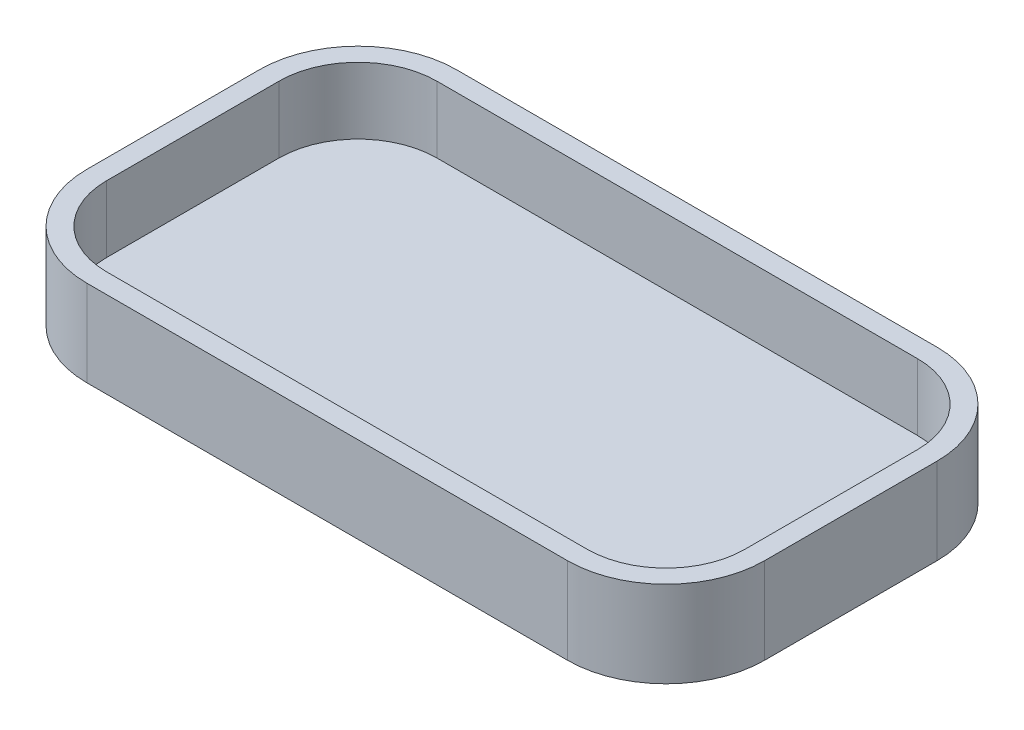
ISO-10303-21;
HEADER;
FILE_DESCRIPTION(('STEP AP214'),'2;1');
FILE_NAME('part.step','',(''),(''),'','','');
FILE_SCHEMA(('AUTOMOTIVE_DESIGN { 1 0 10303 214 1 1 1 1 }'));
ENDSEC;
DATA;
#1=APPLICATION_CONTEXT('core data for automotive mechanical design processes');
#2=APPLICATION_PROTOCOL_DEFINITION('international standard','automotive_design',2000,#1);
#3=PRODUCT_CONTEXT('',#1,'mechanical');
#4=PRODUCT('Part','Part','',(#3));
#5=PRODUCT_RELATED_PRODUCT_CATEGORY('part','',(#4));
#6=PRODUCT_DEFINITION_FORMATION('','',#4);
#7=PRODUCT_DEFINITION_CONTEXT('part definition',#1,'design');
#8=PRODUCT_DEFINITION('design','',#6,#7);
#9=PRODUCT_DEFINITION_SHAPE('','',#8);
#10=(LENGTH_UNIT() NAMED_UNIT(*) SI_UNIT(.MILLI.,.METRE.));
#11=(NAMED_UNIT(*) PLANE_ANGLE_UNIT() SI_UNIT($,.RADIAN.));
#12=(NAMED_UNIT(*) SI_UNIT($,.STERADIAN.) SOLID_ANGLE_UNIT());
#13=UNCERTAINTY_MEASURE_WITH_UNIT(LENGTH_MEASURE(1.E-05),#10,'distance_accuracy_value','');
#14=(GEOMETRIC_REPRESENTATION_CONTEXT(3) GLOBAL_UNCERTAINTY_ASSIGNED_CONTEXT((#13)) GLOBAL_UNIT_ASSIGNED_CONTEXT((#10,
#11,#12)) REPRESENTATION_CONTEXT('',''));
#15=CARTESIAN_POINT('',(0.,0.,0.));
#16=DIRECTION('',(0.,0.,1.));
#17=DIRECTION('',(1.,0.,0.));
#18=AXIS2_PLACEMENT_3D('',#15,#16,#17);
#19=CARTESIAN_POINT('',(27.5,7.,15.));
#20=DIRECTION('',(-1.,0.,0.));
#21=DIRECTION('',(0.,0.,1.));
#22=AXIS2_PLACEMENT_3D('',#19,#20,#21);
#23=PLANE('',#22);
#24=DIRECTION('',(0.,0.,-1.));
#25=VECTOR('',#24,1.);
#26=CARTESIAN_POINT('',(27.5,0.,15.));
#27=LINE('',#26,#25);
#28=CARTESIAN_POINT('',(27.5,0.,7.));
#29=VERTEX_POINT('',#28);
#30=CARTESIAN_POINT('',(27.5,0.,-7.));
#31=VERTEX_POINT('',#30);
#32=EDGE_CURVE('E206',#29,#31,#27,.T.);
#33=ORIENTED_EDGE('',*,*,#32,.T.);
#34=DIRECTION('',(0.,-1.,0.));
#35=VECTOR('',#34,1.);
#36=CARTESIAN_POINT('',(27.5,7.,-7.));
#37=LINE('',#36,#35);
#38=CARTESIAN_POINT('',(27.5,7.,-7.));
#39=VERTEX_POINT('',#38);
#40=EDGE_CURVE('E271',#31,#39,#37,.F.);
#41=ORIENTED_EDGE('',*,*,#40,.T.);
#42=DIRECTION('',(0.,0.,-1.));
#43=VECTOR('',#42,1.);
#44=CARTESIAN_POINT('',(27.5,7.,15.));
#45=LINE('',#44,#43);
#46=CARTESIAN_POINT('',(27.5,7.,7.));
#47=VERTEX_POINT('',#46);
#48=EDGE_CURVE('E222',#47,#39,#45,.T.);
#49=ORIENTED_EDGE('',*,*,#48,.F.);
#50=DIRECTION('',(0.,-1.,0.));
#51=VECTOR('',#50,1.);
#52=CARTESIAN_POINT('',(27.5,7.,7.));
#53=LINE('',#52,#51);
#54=EDGE_CURVE('E268',#47,#29,#53,.T.);
#55=ORIENTED_EDGE('',*,*,#54,.T.);
#56=EDGE_LOOP('',(#33,#41,#49,#55));
#57=FACE_BOUND('',#56,.T.);
#58=ADVANCED_FACE('F44',(#57),#23,.F.);
#59=CARTESIAN_POINT('',(-27.5,7.,-15.));
#60=DIRECTION('',(0.,0.,1.));
#61=DIRECTION('',(1.,0.,0.));
#62=AXIS2_PLACEMENT_3D('',#59,#60,#61);
#63=PLANE('',#62);
#64=DIRECTION('',(-1.,0.,0.));
#65=VECTOR('',#64,1.);
#66=CARTESIAN_POINT('',(-27.5,0.,-15.));
#67=LINE('',#66,#65);
#68=CARTESIAN_POINT('',(19.5,0.,-15.));
#69=VERTEX_POINT('',#68);
#70=CARTESIAN_POINT('',(-19.5,0.,-15.));
#71=VERTEX_POINT('',#70);
#72=EDGE_CURVE('E237',#69,#71,#67,.T.);
#73=ORIENTED_EDGE('',*,*,#72,.T.);
#74=DIRECTION('',(0.,-1.,0.));
#75=VECTOR('',#74,1.);
#76=CARTESIAN_POINT('',(-19.5,7.,-15.));
#77=LINE('',#76,#75);
#78=CARTESIAN_POINT('',(-19.5,7.,-15.));
#79=VERTEX_POINT('',#78);
#80=EDGE_CURVE('E256',#71,#79,#77,.F.);
#81=ORIENTED_EDGE('',*,*,#80,.T.);
#82=DIRECTION('',(-1.,0.,0.));
#83=VECTOR('',#82,1.);
#84=CARTESIAN_POINT('',(-27.5,7.,-15.));
#85=LINE('',#84,#83);
#86=CARTESIAN_POINT('',(19.5,7.,-15.));
#87=VERTEX_POINT('',#86);
#88=EDGE_CURVE('E221',#87,#79,#85,.T.);
#89=ORIENTED_EDGE('',*,*,#88,.F.);
#90=DIRECTION('',(0.,-1.,0.));
#91=VECTOR('',#90,1.);
#92=CARTESIAN_POINT('',(19.5,7.,-15.));
#93=LINE('',#92,#91);
#94=EDGE_CURVE('E254',#87,#69,#93,.T.);
#95=ORIENTED_EDGE('',*,*,#94,.T.);
#96=EDGE_LOOP('',(#73,#81,#89,#95));
#97=FACE_BOUND('',#96,.T.);
#98=ADVANCED_FACE('F300',(#97),#63,.F.);
#99=CARTESIAN_POINT('',(-27.5,7.,15.));
#100=DIRECTION('',(1.,0.,0.));
#101=DIRECTION('',(0.,0.,-1.));
#102=AXIS2_PLACEMENT_3D('',#99,#100,#101);
#103=PLANE('',#102);
#104=DIRECTION('',(0.,0.,1.));
#105=VECTOR('',#104,1.);
#106=CARTESIAN_POINT('',(-27.5,7.,15.));
#107=LINE('',#106,#105);
#108=CARTESIAN_POINT('',(-27.5,7.,-7.));
#109=VERTEX_POINT('',#108);
#110=CARTESIAN_POINT('',(-27.5,7.,7.));
#111=VERTEX_POINT('',#110);
#112=EDGE_CURVE('E230',#109,#111,#107,.T.);
#113=ORIENTED_EDGE('',*,*,#112,.F.);
#114=DIRECTION('',(0.,-1.,0.));
#115=VECTOR('',#114,1.);
#116=CARTESIAN_POINT('',(-27.5,7.,-7.));
#117=LINE('',#116,#115);
#118=CARTESIAN_POINT('',(-27.5,0.,-7.));
#119=VERTEX_POINT('',#118);
#120=EDGE_CURVE('E243',#109,#119,#117,.T.);
#121=ORIENTED_EDGE('',*,*,#120,.T.);
#122=DIRECTION('',(0.,0.,1.));
#123=VECTOR('',#122,1.);
#124=CARTESIAN_POINT('',(-27.5,0.,15.));
#125=LINE('',#124,#123);
#126=CARTESIAN_POINT('',(-27.5,0.,7.));
#127=VERTEX_POINT('',#126);
#128=EDGE_CURVE('E239',#119,#127,#125,.T.);
#129=ORIENTED_EDGE('',*,*,#128,.T.);
#130=DIRECTION('',(0.,-1.,0.));
#131=VECTOR('',#130,1.);
#132=CARTESIAN_POINT('',(-27.5,7.,7.));
#133=LINE('',#132,#131);
#134=EDGE_CURVE('E233',#127,#111,#133,.F.);
#135=ORIENTED_EDGE('',*,*,#134,.T.);
#136=EDGE_LOOP('',(#113,#121,#129,#135));
#137=FACE_BOUND('',#136,.T.);
#138=ADVANCED_FACE('F308',(#137),#103,.F.);
#139=CARTESIAN_POINT('',(-27.5,7.,15.));
#140=DIRECTION('',(0.,0.,-1.));
#141=DIRECTION('',(-1.,0.,0.));
#142=AXIS2_PLACEMENT_3D('',#139,#140,#141);
#143=PLANE('',#142);
#144=DIRECTION('',(1.,0.,0.));
#145=VECTOR('',#144,1.);
#146=CARTESIAN_POINT('',(-27.5,0.,15.));
#147=LINE('',#146,#145);
#148=CARTESIAN_POINT('',(-19.5,0.,15.));
#149=VERTEX_POINT('',#148);
#150=CARTESIAN_POINT('',(19.5,0.,15.));
#151=VERTEX_POINT('',#150);
#152=EDGE_CURVE('E223',#149,#151,#147,.T.);
#153=ORIENTED_EDGE('',*,*,#152,.T.);
#154=DIRECTION('',(0.,-1.,0.));
#155=VECTOR('',#154,1.);
#156=CARTESIAN_POINT('',(19.5,7.,15.));
#157=LINE('',#156,#155);
#158=CARTESIAN_POINT('',(19.5,7.,15.));
#159=VERTEX_POINT('',#158);
#160=EDGE_CURVE('E11',#151,#159,#157,.F.);
#161=ORIENTED_EDGE('',*,*,#160,.T.);
#162=DIRECTION('',(1.,0.,0.));
#163=VECTOR('',#162,1.);
#164=CARTESIAN_POINT('',(-27.5,7.,15.));
#165=LINE('',#164,#163);
#166=CARTESIAN_POINT('',(-19.5,7.,15.));
#167=VERTEX_POINT('',#166);
#168=EDGE_CURVE('E231',#167,#159,#165,.T.);
#169=ORIENTED_EDGE('',*,*,#168,.F.);
#170=DIRECTION('',(0.,-1.,0.));
#171=VECTOR('',#170,1.);
#172=CARTESIAN_POINT('',(-19.5,7.,15.));
#173=LINE('',#172,#171);
#174=EDGE_CURVE('E52',#167,#149,#173,.T.);
#175=ORIENTED_EDGE('',*,*,#174,.T.);
#176=EDGE_LOOP('',(#153,#161,#169,#175));
#177=FACE_BOUND('',#176,.T.);
#178=ADVANCED_FACE('F274',(#177),#143,.F.);
#179=CARTESIAN_POINT('',(0.,7.,0.));
#180=DIRECTION('',(0.,-1.,0.));
#181=DIRECTION('',(0.,0.,-1.));
#182=AXIS2_PLACEMENT_3D('',#179,#180,#181);
#183=PLANE('',#182);
#184=DIRECTION('',(-1.,0.,0.));
#185=VECTOR('',#184,1.);
#186=CARTESIAN_POINT('',(0.,7.,-13.4));
#187=LINE('',#186,#185);
#188=CARTESIAN_POINT('',(19.5,7.,-13.4));
#189=VERTEX_POINT('',#188);
#190=CARTESIAN_POINT('',(-19.5,7.,-13.4));
#191=VERTEX_POINT('',#190);
#192=EDGE_CURVE('E183',#189,#191,#187,.T.);
#193=ORIENTED_EDGE('',*,*,#192,.F.);
#194=CARTESIAN_POINT('',(19.5,7.,-7.));
#195=DIRECTION('',(0.,-1.,0.));
#196=DIRECTION('',(0.,0.,-1.));
#197=AXIS2_PLACEMENT_3D('',#194,#195,#196);
#198=CIRCLE('',#197,6.4);
#199=CARTESIAN_POINT('',(25.9,7.,-7.));
#200=VERTEX_POINT('',#199);
#201=EDGE_CURVE('E207',#200,#189,#198,.F.);
#202=ORIENTED_EDGE('',*,*,#201,.F.);
#203=DIRECTION('',(0.,0.,-1.));
#204=VECTOR('',#203,1.);
#205=CARTESIAN_POINT('',(25.9,7.,0.));
#206=LINE('',#205,#204);
#207=CARTESIAN_POINT('',(25.9,7.,7.));
#208=VERTEX_POINT('',#207);
#209=EDGE_CURVE('E58',#208,#200,#206,.T.);
#210=ORIENTED_EDGE('',*,*,#209,.F.);
#211=CARTESIAN_POINT('',(19.5,7.,7.));
#212=DIRECTION('',(0.,-1.,0.));
#213=DIRECTION('',(0.,0.,-1.));
#214=AXIS2_PLACEMENT_3D('',#211,#212,#213);
#215=CIRCLE('',#214,6.4);
#216=CARTESIAN_POINT('',(19.5,7.,13.4));
#217=VERTEX_POINT('',#216);
#218=EDGE_CURVE('E188',#217,#208,#215,.F.);
#219=ORIENTED_EDGE('',*,*,#218,.F.);
#220=DIRECTION('',(1.,0.,0.));
#221=VECTOR('',#220,1.);
#222=CARTESIAN_POINT('',(0.,7.,13.4));
#223=LINE('',#222,#221);
#224=CARTESIAN_POINT('',(-19.5,7.,13.4));
#225=VERTEX_POINT('',#224);
#226=EDGE_CURVE('E200',#225,#217,#223,.T.);
#227=ORIENTED_EDGE('',*,*,#226,.F.);
#228=CARTESIAN_POINT('',(-19.5,7.,7.));
#229=DIRECTION('',(0.,-1.,0.));
#230=DIRECTION('',(0.,0.,-1.));
#231=AXIS2_PLACEMENT_3D('',#228,#229,#230);
#232=CIRCLE('',#231,6.4);
#233=CARTESIAN_POINT('',(-25.9,7.,7.));
#234=VERTEX_POINT('',#233);
#235=EDGE_CURVE('E186',#234,#225,#232,.F.);
#236=ORIENTED_EDGE('',*,*,#235,.F.);
#237=DIRECTION('',(0.,0.,1.));
#238=VECTOR('',#237,1.);
#239=CARTESIAN_POINT('',(-25.9,7.,0.));
#240=LINE('',#239,#238);
#241=CARTESIAN_POINT('',(-25.9,7.,-7.));
#242=VERTEX_POINT('',#241);
#243=EDGE_CURVE('E213',#242,#234,#240,.T.);
#244=ORIENTED_EDGE('',*,*,#243,.F.);
#245=CARTESIAN_POINT('',(-19.5,7.,-7.));
#246=DIRECTION('',(0.,-1.,0.));
#247=DIRECTION('',(0.,0.,-1.));
#248=AXIS2_PLACEMENT_3D('',#245,#246,#247);
#249=CIRCLE('',#248,6.4);
#250=EDGE_CURVE('E211',#191,#242,#249,.F.);
#251=ORIENTED_EDGE('',*,*,#250,.F.);
#252=EDGE_LOOP('',(#193,#202,#210,#219,#227,#236,#244,#251));
#253=FACE_BOUND('',#252,.T.);
#254=ORIENTED_EDGE('',*,*,#88,.T.);
#255=CARTESIAN_POINT('',(-19.5,7.,-7.));
#256=DIRECTION('',(0.,-1.,0.));
#257=DIRECTION('',(0.,0.,-1.));
#258=AXIS2_PLACEMENT_3D('',#255,#256,#257);
#259=CIRCLE('',#258,8.);
#260=EDGE_CURVE('E266',#79,#109,#259,.F.);
#261=ORIENTED_EDGE('',*,*,#260,.T.);
#262=ORIENTED_EDGE('',*,*,#112,.T.);
#263=CARTESIAN_POINT('',(-19.5,7.,7.));
#264=DIRECTION('',(0.,-1.,0.));
#265=DIRECTION('',(0.,0.,-1.));
#266=AXIS2_PLACEMENT_3D('',#263,#264,#265);
#267=CIRCLE('',#266,8.);
#268=EDGE_CURVE('E257',#111,#167,#267,.F.);
#269=ORIENTED_EDGE('',*,*,#268,.T.);
#270=ORIENTED_EDGE('',*,*,#168,.T.);
#271=CARTESIAN_POINT('',(19.5,7.,7.));
#272=DIRECTION('',(0.,-1.,0.));
#273=DIRECTION('',(0.,0.,-1.));
#274=AXIS2_PLACEMENT_3D('',#271,#272,#273);
#275=CIRCLE('',#274,8.);
#276=EDGE_CURVE('E265',#159,#47,#275,.F.);
#277=ORIENTED_EDGE('',*,*,#276,.T.);
#278=ORIENTED_EDGE('',*,*,#48,.T.);
#279=CARTESIAN_POINT('',(19.5,7.,-7.));
#280=DIRECTION('',(0.,-1.,0.));
#281=DIRECTION('',(0.,0.,-1.));
#282=AXIS2_PLACEMENT_3D('',#279,#280,#281);
#283=CIRCLE('',#282,8.);
#284=EDGE_CURVE('E262',#39,#87,#283,.F.);
#285=ORIENTED_EDGE('',*,*,#284,.T.);
#286=EDGE_LOOP('',(#254,#261,#262,#269,#270,#277,#278,#285));
#287=FACE_BOUND('',#286,.T.);
#288=ADVANCED_FACE('F292',(#253,#287),#183,.F.);
#289=CARTESIAN_POINT('',(0.,0.,0.));
#290=DIRECTION('',(0.,-1.,0.));
#291=DIRECTION('',(0.,0.,-1.));
#292=AXIS2_PLACEMENT_3D('',#289,#290,#291);
#293=PLANE('',#292);
#294=ORIENTED_EDGE('',*,*,#128,.F.);
#295=CARTESIAN_POINT('',(-19.5,0.,-7.));
#296=DIRECTION('',(0.,-1.,0.));
#297=DIRECTION('',(0.,0.,-1.));
#298=AXIS2_PLACEMENT_3D('',#295,#296,#297);
#299=CIRCLE('',#298,8.);
#300=EDGE_CURVE('E251',#119,#71,#299,.T.);
#301=ORIENTED_EDGE('',*,*,#300,.T.);
#302=ORIENTED_EDGE('',*,*,#72,.F.);
#303=CARTESIAN_POINT('',(19.5,0.,-7.));
#304=DIRECTION('',(0.,-1.,0.));
#305=DIRECTION('',(0.,0.,-1.));
#306=AXIS2_PLACEMENT_3D('',#303,#304,#305);
#307=CIRCLE('',#306,8.);
#308=EDGE_CURVE('E253',#69,#31,#307,.T.);
#309=ORIENTED_EDGE('',*,*,#308,.T.);
#310=ORIENTED_EDGE('',*,*,#32,.F.);
#311=CARTESIAN_POINT('',(19.5,0.,7.));
#312=DIRECTION('',(0.,-1.,0.));
#313=DIRECTION('',(0.,0.,-1.));
#314=AXIS2_PLACEMENT_3D('',#311,#312,#313);
#315=CIRCLE('',#314,8.);
#316=EDGE_CURVE('E247',#29,#151,#315,.T.);
#317=ORIENTED_EDGE('',*,*,#316,.T.);
#318=ORIENTED_EDGE('',*,*,#152,.F.);
#319=CARTESIAN_POINT('',(-19.5,0.,7.));
#320=DIRECTION('',(0.,-1.,0.));
#321=DIRECTION('',(0.,0.,-1.));
#322=AXIS2_PLACEMENT_3D('',#319,#320,#321);
#323=CIRCLE('',#322,8.);
#324=EDGE_CURVE('E250',#149,#127,#323,.T.);
#325=ORIENTED_EDGE('',*,*,#324,.T.);
#326=EDGE_LOOP('',(#294,#301,#302,#309,#310,#317,#318,#325));
#327=FACE_BOUND('',#326,.T.);
#328=ADVANCED_FACE('F278',(#327),#293,.T.);
#329=CARTESIAN_POINT('',(-19.5,7.,-7.));
#330=DIRECTION('',(0.,-1.,0.));
#331=DIRECTION('',(0.,0.,-1.));
#332=AXIS2_PLACEMENT_3D('',#329,#330,#331);
#333=CYLINDRICAL_SURFACE('',#332,8.);
#334=ORIENTED_EDGE('',*,*,#260,.F.);
#335=ORIENTED_EDGE('',*,*,#80,.F.);
#336=ORIENTED_EDGE('',*,*,#300,.F.);
#337=ORIENTED_EDGE('',*,*,#120,.F.);
#338=EDGE_LOOP('',(#334,#335,#336,#337));
#339=FACE_BOUND('',#338,.T.);
#340=ADVANCED_FACE('F303',(#339),#333,.T.);
#341=CARTESIAN_POINT('',(19.5,7.,-7.));
#342=DIRECTION('',(0.,-1.,0.));
#343=DIRECTION('',(0.,0.,-1.));
#344=AXIS2_PLACEMENT_3D('',#341,#342,#343);
#345=CYLINDRICAL_SURFACE('',#344,8.);
#346=ORIENTED_EDGE('',*,*,#284,.F.);
#347=ORIENTED_EDGE('',*,*,#40,.F.);
#348=ORIENTED_EDGE('',*,*,#308,.F.);
#349=ORIENTED_EDGE('',*,*,#94,.F.);
#350=EDGE_LOOP('',(#346,#347,#348,#349));
#351=FACE_BOUND('',#350,.T.);
#352=ADVANCED_FACE('F293',(#351),#345,.T.);
#353=CARTESIAN_POINT('',(19.5,7.,7.));
#354=DIRECTION('',(0.,-1.,0.));
#355=DIRECTION('',(0.,0.,-1.));
#356=AXIS2_PLACEMENT_3D('',#353,#354,#355);
#357=CYLINDRICAL_SURFACE('',#356,8.);
#358=ORIENTED_EDGE('',*,*,#276,.F.);
#359=ORIENTED_EDGE('',*,*,#160,.F.);
#360=ORIENTED_EDGE('',*,*,#316,.F.);
#361=ORIENTED_EDGE('',*,*,#54,.F.);
#362=EDGE_LOOP('',(#358,#359,#360,#361));
#363=FACE_BOUND('',#362,.T.);
#364=ADVANCED_FACE('F282',(#363),#357,.T.);
#365=CARTESIAN_POINT('',(-19.5,7.,7.));
#366=DIRECTION('',(0.,-1.,0.));
#367=DIRECTION('',(0.,0.,-1.));
#368=AXIS2_PLACEMENT_3D('',#365,#366,#367);
#369=CYLINDRICAL_SURFACE('',#368,8.);
#370=ORIENTED_EDGE('',*,*,#268,.F.);
#371=ORIENTED_EDGE('',*,*,#134,.F.);
#372=ORIENTED_EDGE('',*,*,#324,.F.);
#373=ORIENTED_EDGE('',*,*,#174,.F.);
#374=EDGE_LOOP('',(#370,#371,#372,#373));
#375=FACE_BOUND('',#374,.T.);
#376=ADVANCED_FACE('F50',(#375),#369,.T.);
#377=CARTESIAN_POINT('',(25.9,7.,15.));
#378=DIRECTION('',(-1.,0.,0.));
#379=DIRECTION('',(0.,0.,1.));
#380=AXIS2_PLACEMENT_3D('',#377,#378,#379);
#381=PLANE('',#380);
#382=DIRECTION('',(0.,0.,-1.));
#383=VECTOR('',#382,1.);
#384=CARTESIAN_POINT('',(25.9,1.6,0.));
#385=LINE('',#384,#383);
#386=CARTESIAN_POINT('',(25.9,1.6,7.));
#387=VERTEX_POINT('',#386);
#388=CARTESIAN_POINT('',(25.9,1.6,-7.));
#389=VERTEX_POINT('',#388);
#390=EDGE_CURVE('E182',#387,#389,#385,.T.);
#391=ORIENTED_EDGE('',*,*,#390,.F.);
#392=DIRECTION('',(0.,1.,0.));
#393=VECTOR('',#392,1.);
#394=CARTESIAN_POINT('',(25.9,7.,7.));
#395=LINE('',#394,#393);
#396=EDGE_CURVE('E214',#208,#387,#395,.F.);
#397=ORIENTED_EDGE('',*,*,#396,.F.);
#398=ORIENTED_EDGE('',*,*,#209,.T.);
#399=DIRECTION('',(0.,1.,0.));
#400=VECTOR('',#399,1.);
#401=CARTESIAN_POINT('',(25.9,7.,-7.));
#402=LINE('',#401,#400);
#403=EDGE_CURVE('E204',#389,#200,#402,.T.);
#404=ORIENTED_EDGE('',*,*,#403,.F.);
#405=EDGE_LOOP('',(#391,#397,#398,#404));
#406=FACE_BOUND('',#405,.T.);
#407=ADVANCED_FACE('F310',(#406),#381,.T.);
#408=CARTESIAN_POINT('',(-27.5,7.,-13.4));
#409=DIRECTION('',(0.,0.,1.));
#410=DIRECTION('',(1.,0.,0.));
#411=AXIS2_PLACEMENT_3D('',#408,#409,#410);
#412=PLANE('',#411);
#413=DIRECTION('',(-1.,0.,0.));
#414=VECTOR('',#413,1.);
#415=CARTESIAN_POINT('',(0.,1.6,-13.4));
#416=LINE('',#415,#414);
#417=CARTESIAN_POINT('',(19.5,1.6,-13.4));
#418=VERTEX_POINT('',#417);
#419=CARTESIAN_POINT('',(-19.5,1.6,-13.4));
#420=VERTEX_POINT('',#419);
#421=EDGE_CURVE('E173',#418,#420,#416,.T.);
#422=ORIENTED_EDGE('',*,*,#421,.F.);
#423=DIRECTION('',(0.,1.,0.));
#424=VECTOR('',#423,1.);
#425=CARTESIAN_POINT('',(19.5,7.,-13.4));
#426=LINE('',#425,#424);
#427=EDGE_CURVE('E168',#189,#418,#426,.F.);
#428=ORIENTED_EDGE('',*,*,#427,.F.);
#429=ORIENTED_EDGE('',*,*,#192,.T.);
#430=DIRECTION('',(0.,1.,0.));
#431=VECTOR('',#430,1.);
#432=CARTESIAN_POINT('',(-19.5,7.,-13.4));
#433=LINE('',#432,#431);
#434=EDGE_CURVE('E162',#420,#191,#433,.T.);
#435=ORIENTED_EDGE('',*,*,#434,.F.);
#436=EDGE_LOOP('',(#422,#428,#429,#435));
#437=FACE_BOUND('',#436,.T.);
#438=ADVANCED_FACE('F181',(#437),#412,.T.);
#439=CARTESIAN_POINT('',(-25.9,7.,15.));
#440=DIRECTION('',(1.,0.,0.));
#441=DIRECTION('',(0.,0.,-1.));
#442=AXIS2_PLACEMENT_3D('',#439,#440,#441);
#443=PLANE('',#442);
#444=ORIENTED_EDGE('',*,*,#243,.T.);
#445=DIRECTION('',(0.,1.,0.));
#446=VECTOR('',#445,1.);
#447=CARTESIAN_POINT('',(-25.9,7.,7.));
#448=LINE('',#447,#446);
#449=CARTESIAN_POINT('',(-25.9,1.6,7.));
#450=VERTEX_POINT('',#449);
#451=EDGE_CURVE('E197',#450,#234,#448,.T.);
#452=ORIENTED_EDGE('',*,*,#451,.F.);
#453=DIRECTION('',(0.,0.,1.));
#454=VECTOR('',#453,1.);
#455=CARTESIAN_POINT('',(-25.9,1.6,0.));
#456=LINE('',#455,#454);
#457=CARTESIAN_POINT('',(-25.9,1.6,-7.));
#458=VERTEX_POINT('',#457);
#459=EDGE_CURVE('E179',#458,#450,#456,.T.);
#460=ORIENTED_EDGE('',*,*,#459,.F.);
#461=DIRECTION('',(0.,1.,0.));
#462=VECTOR('',#461,1.);
#463=CARTESIAN_POINT('',(-25.9,7.,-7.));
#464=LINE('',#463,#462);
#465=EDGE_CURVE('E167',#242,#458,#464,.F.);
#466=ORIENTED_EDGE('',*,*,#465,.F.);
#467=EDGE_LOOP('',(#444,#452,#460,#466));
#468=FACE_BOUND('',#467,.T.);
#469=ADVANCED_FACE('F360',(#468),#443,.T.);
#470=CARTESIAN_POINT('',(-27.5,7.,13.4));
#471=DIRECTION('',(0.,0.,-1.));
#472=DIRECTION('',(-1.,0.,0.));
#473=AXIS2_PLACEMENT_3D('',#470,#471,#472);
#474=PLANE('',#473);
#475=DIRECTION('',(1.,0.,0.));
#476=VECTOR('',#475,1.);
#477=CARTESIAN_POINT('',(0.,1.6,13.4));
#478=LINE('',#477,#476);
#479=CARTESIAN_POINT('',(-19.5,1.6,13.4));
#480=VERTEX_POINT('',#479);
#481=CARTESIAN_POINT('',(19.5,1.6,13.4));
#482=VERTEX_POINT('',#481);
#483=EDGE_CURVE('E208',#480,#482,#478,.T.);
#484=ORIENTED_EDGE('',*,*,#483,.F.);
#485=DIRECTION('',(0.,1.,0.));
#486=VECTOR('',#485,1.);
#487=CARTESIAN_POINT('',(-19.5,7.,13.4));
#488=LINE('',#487,#486);
#489=EDGE_CURVE('E199',#225,#480,#488,.F.);
#490=ORIENTED_EDGE('',*,*,#489,.F.);
#491=ORIENTED_EDGE('',*,*,#226,.T.);
#492=DIRECTION('',(0.,1.,0.));
#493=VECTOR('',#492,1.);
#494=CARTESIAN_POINT('',(19.5,7.,13.4));
#495=LINE('',#494,#493);
#496=EDGE_CURVE('E201',#482,#217,#495,.T.);
#497=ORIENTED_EDGE('',*,*,#496,.F.);
#498=EDGE_LOOP('',(#484,#490,#491,#497));
#499=FACE_BOUND('',#498,.T.);
#500=ADVANCED_FACE('F368',(#499),#474,.T.);
#501=CARTESIAN_POINT('',(0.,1.6,0.));
#502=DIRECTION('',(0.,-1.,0.));
#503=DIRECTION('',(0.,0.,-1.));
#504=AXIS2_PLACEMENT_3D('',#501,#502,#503);
#505=PLANE('',#504);
#506=ORIENTED_EDGE('',*,*,#459,.T.);
#507=CARTESIAN_POINT('',(-19.5,1.6,7.));
#508=DIRECTION('',(0.,-1.,0.));
#509=DIRECTION('',(0.,0.,-1.));
#510=AXIS2_PLACEMENT_3D('',#507,#508,#509);
#511=CIRCLE('',#510,6.4);
#512=EDGE_CURVE('E193',#480,#450,#511,.T.);
#513=ORIENTED_EDGE('',*,*,#512,.F.);
#514=ORIENTED_EDGE('',*,*,#483,.T.);
#515=CARTESIAN_POINT('',(19.5,1.6,7.));
#516=DIRECTION('',(0.,-1.,0.));
#517=DIRECTION('',(0.,0.,-1.));
#518=AXIS2_PLACEMENT_3D('',#515,#516,#517);
#519=CIRCLE('',#518,6.4);
#520=EDGE_CURVE('E477',#387,#482,#519,.T.);
#521=ORIENTED_EDGE('',*,*,#520,.F.);
#522=ORIENTED_EDGE('',*,*,#390,.T.);
#523=CARTESIAN_POINT('',(19.5,1.6,-7.));
#524=DIRECTION('',(0.,-1.,0.));
#525=DIRECTION('',(0.,0.,-1.));
#526=AXIS2_PLACEMENT_3D('',#523,#524,#525);
#527=CIRCLE('',#526,6.4);
#528=EDGE_CURVE('E174',#418,#389,#527,.T.);
#529=ORIENTED_EDGE('',*,*,#528,.F.);
#530=ORIENTED_EDGE('',*,*,#421,.T.);
#531=CARTESIAN_POINT('',(-19.5,1.6,-7.));
#532=DIRECTION('',(0.,-1.,0.));
#533=DIRECTION('',(0.,0.,-1.));
#534=AXIS2_PLACEMENT_3D('',#531,#532,#533);
#535=CIRCLE('',#534,6.4);
#536=EDGE_CURVE('E157',#458,#420,#535,.T.);
#537=ORIENTED_EDGE('',*,*,#536,.F.);
#538=EDGE_LOOP('',(#506,#513,#514,#521,#522,#529,#530,#537));
#539=FACE_BOUND('',#538,.T.);
#540=ADVANCED_FACE('F172',(#539),#505,.F.);
#541=CARTESIAN_POINT('',(-19.5,7.,-7.));
#542=DIRECTION('',(0.,-1.,0.));
#543=DIRECTION('',(0.,0.,-1.));
#544=AXIS2_PLACEMENT_3D('',#541,#542,#543);
#545=CYLINDRICAL_SURFACE('',#544,6.4);
#546=ORIENTED_EDGE('',*,*,#250,.T.);
#547=ORIENTED_EDGE('',*,*,#465,.T.);
#548=ORIENTED_EDGE('',*,*,#536,.T.);
#549=ORIENTED_EDGE('',*,*,#434,.T.);
#550=EDGE_LOOP('',(#546,#547,#548,#549));
#551=FACE_BOUND('',#550,.T.);
#552=ADVANCED_FACE('F161',(#551),#545,.F.);
#553=CARTESIAN_POINT('',(19.5,7.,-7.));
#554=DIRECTION('',(0.,-1.,0.));
#555=DIRECTION('',(0.,0.,-1.));
#556=AXIS2_PLACEMENT_3D('',#553,#554,#555);
#557=CYLINDRICAL_SURFACE('',#556,6.4);
#558=ORIENTED_EDGE('',*,*,#201,.T.);
#559=ORIENTED_EDGE('',*,*,#427,.T.);
#560=ORIENTED_EDGE('',*,*,#528,.T.);
#561=ORIENTED_EDGE('',*,*,#403,.T.);
#562=EDGE_LOOP('',(#558,#559,#560,#561));
#563=FACE_BOUND('',#562,.T.);
#564=ADVANCED_FACE('F395',(#563),#557,.F.);
#565=CARTESIAN_POINT('',(19.5,7.,7.));
#566=DIRECTION('',(0.,-1.,0.));
#567=DIRECTION('',(0.,0.,-1.));
#568=AXIS2_PLACEMENT_3D('',#565,#566,#567);
#569=CYLINDRICAL_SURFACE('',#568,6.4);
#570=ORIENTED_EDGE('',*,*,#218,.T.);
#571=ORIENTED_EDGE('',*,*,#396,.T.);
#572=ORIENTED_EDGE('',*,*,#520,.T.);
#573=ORIENTED_EDGE('',*,*,#496,.T.);
#574=EDGE_LOOP('',(#570,#571,#572,#573));
#575=FACE_BOUND('',#574,.T.);
#576=ADVANCED_FACE('F405',(#575),#569,.F.);
#577=CARTESIAN_POINT('',(-19.5,7.,7.));
#578=DIRECTION('',(0.,-1.,0.));
#579=DIRECTION('',(0.,0.,-1.));
#580=AXIS2_PLACEMENT_3D('',#577,#578,#579);
#581=CYLINDRICAL_SURFACE('',#580,6.4);
#582=ORIENTED_EDGE('',*,*,#235,.T.);
#583=ORIENTED_EDGE('',*,*,#489,.T.);
#584=ORIENTED_EDGE('',*,*,#512,.T.);
#585=ORIENTED_EDGE('',*,*,#451,.T.);
#586=EDGE_LOOP('',(#582,#583,#584,#585));
#587=FACE_BOUND('',#586,.T.);
#588=ADVANCED_FACE('F415',(#587),#581,.F.);
#589=CLOSED_SHELL('',(#58,#98,#138,#178,#288,#328,#340,#352,#364,#376,#407,#438,#469,#500,#540,
#552,#564,#576,#588));
#590=MANIFOLD_SOLID_BREP('B2',#589);
#591=ADVANCED_BREP_SHAPE_REPRESENTATION('',(#18,#590),#14);
#592=SHAPE_DEFINITION_REPRESENTATION(#9,#591);
ENDSEC;
END-ISO-10303-21;
